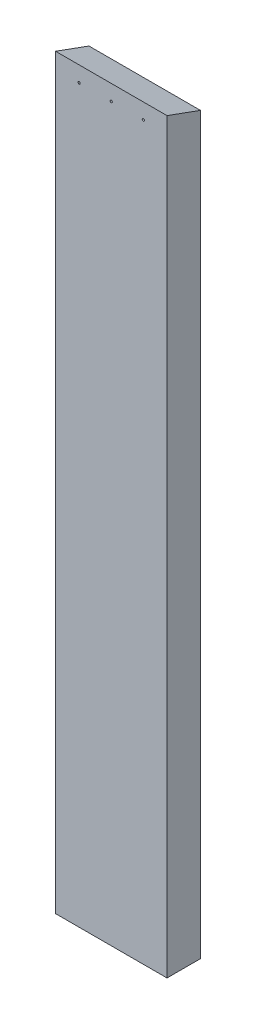
ISO-10303-21;
HEADER;
FILE_DESCRIPTION(('STEP AP214'),'2;1');
FILE_NAME('part.step','',(''),(''),'','','');
FILE_SCHEMA(('AUTOMOTIVE_DESIGN { 1 0 10303 214 1 1 1 1 }'));
ENDSEC;
DATA;
#1=APPLICATION_CONTEXT('core data for automotive mechanical design processes');
#2=APPLICATION_PROTOCOL_DEFINITION('international standard','automotive_design',2000,#1);
#3=PRODUCT_CONTEXT('',#1,'mechanical');
#4=PRODUCT('Part','Part','',(#3));
#5=PRODUCT_RELATED_PRODUCT_CATEGORY('part','',(#4));
#6=PRODUCT_DEFINITION_FORMATION('','',#4);
#7=PRODUCT_DEFINITION_CONTEXT('part definition',#1,'design');
#8=PRODUCT_DEFINITION('design','',#6,#7);
#9=PRODUCT_DEFINITION_SHAPE('','',#8);
#10=(LENGTH_UNIT() NAMED_UNIT(*) SI_UNIT(.MILLI.,.METRE.));
#11=(NAMED_UNIT(*) PLANE_ANGLE_UNIT() SI_UNIT($,.RADIAN.));
#12=(NAMED_UNIT(*) SI_UNIT($,.STERADIAN.) SOLID_ANGLE_UNIT());
#13=UNCERTAINTY_MEASURE_WITH_UNIT(LENGTH_MEASURE(1.E-05),#10,'distance_accuracy_value','');
#14=(GEOMETRIC_REPRESENTATION_CONTEXT(3) GLOBAL_UNCERTAINTY_ASSIGNED_CONTEXT((#13)) GLOBAL_UNIT_ASSIGNED_CONTEXT((#10,
#11,#12)) REPRESENTATION_CONTEXT('',''));
#15=CARTESIAN_POINT('',(0.,0.,0.));
#16=DIRECTION('',(0.,0.,1.));
#17=DIRECTION('',(1.,0.,0.));
#18=AXIS2_PLACEMENT_3D('',#15,#16,#17);
#19=CARTESIAN_POINT('',(0.,425.45,0.));
#20=DIRECTION('',(1.,0.,0.));
#21=DIRECTION('',(0.,0.,-1.));
#22=AXIS2_PLACEMENT_3D('',#19,#20,#21);
#23=PLANE('',#22);
#24=DIRECTION('',(0.,-1.,0.));
#25=VECTOR('',#24,1.);
#26=CARTESIAN_POINT('',(0.,425.45,0.));
#27=LINE('',#26,#25);
#28=CARTESIAN_POINT('',(0.,425.45,0.));
#29=VERTEX_POINT('',#28);
#30=CARTESIAN_POINT('',(0.,0.,0.));
#31=VERTEX_POINT('',#30);
#32=EDGE_CURVE('E11',#29,#31,#27,.T.);
#33=ORIENTED_EDGE('',*,*,#32,.F.);
#34=DIRECTION('',(0.,0.342020143325664,0.93969262078591));
#35=VECTOR('',#34,1.);
#36=CARTESIAN_POINT('',(0.,425.45,0.));
#37=LINE('',#36,#35);
#38=CARTESIAN_POINT('',(0.,418.516367037229,-19.05));
#39=VERTEX_POINT('',#38);
#40=EDGE_CURVE('E58',#39,#29,#37,.T.);
#41=ORIENTED_EDGE('',*,*,#40,.F.);
#42=DIRECTION('',(0.,-1.,0.));
#43=VECTOR('',#42,1.);
#44=CARTESIAN_POINT('',(0.,425.45,-19.05));
#45=LINE('',#44,#43);
#46=CARTESIAN_POINT('',(0.,0.,-19.05));
#47=VERTEX_POINT('',#46);
#48=EDGE_CURVE('E88',#39,#47,#45,.T.);
#49=ORIENTED_EDGE('',*,*,#48,.T.);
#50=DIRECTION('',(0.,0.,1.));
#51=VECTOR('',#50,1.);
#52=CARTESIAN_POINT('',(0.,0.,0.));
#53=LINE('',#52,#51);
#54=EDGE_CURVE('E100',#47,#31,#53,.T.);
#55=ORIENTED_EDGE('',*,*,#54,.T.);
#56=EDGE_LOOP('',(#33,#41,#49,#55));
#57=FACE_BOUND('',#56,.T.);
#58=ADVANCED_FACE('F41',(#57),#23,.F.);
#59=CARTESIAN_POINT('',(0.,425.45,0.));
#60=DIRECTION('',(0.,0.,-1.));
#61=DIRECTION('',(-1.,0.,0.));
#62=AXIS2_PLACEMENT_3D('',#59,#60,#61);
#63=PLANE('',#62);
#64=CARTESIAN_POINT('',(13.4366000714349,416.56,0.));
#65=DIRECTION('',(0.,0.,1.));
#66=DIRECTION('',(-1.,0.,0.));
#67=AXIS2_PLACEMENT_3D('',#64,#65,#66);
#68=CIRCLE('',#67,0.634999999999992);
#69=CARTESIAN_POINT('',(12.8016000714349,416.56,0.));
#70=VERTEX_POINT('',#69);
#71=EDGE_CURVE('E140',#70,#70,#68,.T.);
#72=ORIENTED_EDGE('',*,*,#71,.F.);
#73=EDGE_LOOP('',(#72));
#74=FACE_BOUND('',#73,.T.);
#75=CARTESIAN_POINT('',(50.0126000714349,416.56,0.));
#76=DIRECTION('',(0.,0.,1.));
#77=DIRECTION('',(1.,0.,0.));
#78=AXIS2_PLACEMENT_3D('',#75,#76,#77);
#79=CIRCLE('',#78,0.634999999999985);
#80=CARTESIAN_POINT('',(50.6476000714348,416.56,0.));
#81=VERTEX_POINT('',#80);
#82=EDGE_CURVE('E134',#81,#81,#79,.T.);
#83=ORIENTED_EDGE('',*,*,#82,.F.);
#84=EDGE_LOOP('',(#83));
#85=FACE_BOUND('',#84,.T.);
#86=CARTESIAN_POINT('',(31.7246000714349,416.56,0.));
#87=DIRECTION('',(0.,0.,1.));
#88=DIRECTION('',(1.,0.,0.));
#89=AXIS2_PLACEMENT_3D('',#86,#87,#88);
#90=CIRCLE('',#89,0.634999999999985);
#91=CARTESIAN_POINT('',(32.3596000714348,416.56,0.));
#92=VERTEX_POINT('',#91);
#93=EDGE_CURVE('E131',#92,#92,#90,.T.);
#94=ORIENTED_EDGE('',*,*,#93,.F.);
#95=EDGE_LOOP('',(#94));
#96=FACE_BOUND('',#95,.T.);
#97=DIRECTION('',(1.,0.,0.));
#98=VECTOR('',#97,1.);
#99=CARTESIAN_POINT('',(0.,0.,0.));
#100=LINE('',#99,#98);
#101=CARTESIAN_POINT('',(63.5,0.,0.));
#102=VERTEX_POINT('',#101);
#103=EDGE_CURVE('E96',#31,#102,#100,.T.);
#104=ORIENTED_EDGE('',*,*,#103,.T.);
#105=DIRECTION('',(0.,-1.,0.));
#106=VECTOR('',#105,1.);
#107=CARTESIAN_POINT('',(63.5,425.45,0.));
#108=LINE('',#107,#106);
#109=CARTESIAN_POINT('',(63.5,425.45,0.));
#110=VERTEX_POINT('',#109);
#111=EDGE_CURVE('E50',#110,#102,#108,.T.);
#112=ORIENTED_EDGE('',*,*,#111,.F.);
#113=DIRECTION('',(1.,0.,0.));
#114=VECTOR('',#113,1.);
#115=CARTESIAN_POINT('',(0.,425.45,0.));
#116=LINE('',#115,#114);
#117=EDGE_CURVE('E101',#29,#110,#116,.T.);
#118=ORIENTED_EDGE('',*,*,#117,.F.);
#119=ORIENTED_EDGE('',*,*,#32,.T.);
#120=EDGE_LOOP('',(#104,#112,#118,#119));
#121=FACE_BOUND('',#120,.T.);
#122=ADVANCED_FACE('F153',(#74,#85,#96,#121),#63,.F.);
#123=CARTESIAN_POINT('',(63.5,425.45,0.));
#124=DIRECTION('',(-1.,0.,0.));
#125=DIRECTION('',(0.,0.,1.));
#126=AXIS2_PLACEMENT_3D('',#123,#124,#125);
#127=PLANE('',#126);
#128=DIRECTION('',(0.,-1.,0.));
#129=VECTOR('',#128,1.);
#130=CARTESIAN_POINT('',(63.5,425.45,-19.05));
#131=LINE('',#130,#129);
#132=CARTESIAN_POINT('',(63.5,418.516367037229,-19.05));
#133=VERTEX_POINT('',#132);
#134=CARTESIAN_POINT('',(63.5,0.,-19.05));
#135=VERTEX_POINT('',#134);
#136=EDGE_CURVE('E77',#133,#135,#131,.T.);
#137=ORIENTED_EDGE('',*,*,#136,.F.);
#138=DIRECTION('',(0.,0.342020143325664,0.93969262078591));
#139=VECTOR('',#138,1.);
#140=CARTESIAN_POINT('',(63.5,425.45,0.));
#141=LINE('',#140,#139);
#142=EDGE_CURVE('E149',#133,#110,#141,.T.);
#143=ORIENTED_EDGE('',*,*,#142,.T.);
#144=ORIENTED_EDGE('',*,*,#111,.T.);
#145=DIRECTION('',(0.,0.,-1.));
#146=VECTOR('',#145,1.);
#147=CARTESIAN_POINT('',(63.5,0.,0.));
#148=LINE('',#147,#146);
#149=EDGE_CURVE('E92',#102,#135,#148,.T.);
#150=ORIENTED_EDGE('',*,*,#149,.T.);
#151=EDGE_LOOP('',(#137,#143,#144,#150));
#152=FACE_BOUND('',#151,.T.);
#153=ADVANCED_FACE('F93',(#152),#127,.F.);
#154=CARTESIAN_POINT('',(0.,425.45,-19.05));
#155=DIRECTION('',(0.,0.,1.));
#156=DIRECTION('',(1.,0.,0.));
#157=AXIS2_PLACEMENT_3D('',#154,#155,#156);
#158=PLANE('',#157);
#159=CARTESIAN_POINT('',(13.4366000714349,416.56,-19.05));
#160=DIRECTION('',(0.,0.,1.));
#161=DIRECTION('',(-1.,0.,0.));
#162=AXIS2_PLACEMENT_3D('',#159,#160,#161);
#163=CIRCLE('',#162,0.634999999999992);
#164=CARTESIAN_POINT('',(12.8016000714349,416.56,-19.05));
#165=VERTEX_POINT('',#164);
#166=EDGE_CURVE('E137',#165,#165,#163,.T.);
#167=ORIENTED_EDGE('',*,*,#166,.T.);
#168=EDGE_LOOP('',(#167));
#169=FACE_BOUND('',#168,.T.);
#170=CARTESIAN_POINT('',(50.0126000714349,416.56,-19.05));
#171=DIRECTION('',(0.,0.,1.));
#172=DIRECTION('',(1.,0.,0.));
#173=AXIS2_PLACEMENT_3D('',#170,#171,#172);
#174=CIRCLE('',#173,0.634999999999985);
#175=CARTESIAN_POINT('',(50.6476000714348,416.56,-19.05));
#176=VERTEX_POINT('',#175);
#177=EDGE_CURVE('E143',#176,#176,#174,.T.);
#178=ORIENTED_EDGE('',*,*,#177,.T.);
#179=EDGE_LOOP('',(#178));
#180=FACE_BOUND('',#179,.T.);
#181=CARTESIAN_POINT('',(31.7246000714349,416.56,-19.05));
#182=DIRECTION('',(0.,0.,1.));
#183=DIRECTION('',(1.,0.,0.));
#184=AXIS2_PLACEMENT_3D('',#181,#182,#183);
#185=CIRCLE('',#184,0.634999999999985);
#186=CARTESIAN_POINT('',(32.3596000714348,416.56,-19.05));
#187=VERTEX_POINT('',#186);
#188=EDGE_CURVE('E126',#187,#187,#185,.T.);
#189=ORIENTED_EDGE('',*,*,#188,.T.);
#190=EDGE_LOOP('',(#189));
#191=FACE_BOUND('',#190,.T.);
#192=ORIENTED_EDGE('',*,*,#48,.F.);
#193=DIRECTION('',(-1.,0.,0.));
#194=VECTOR('',#193,1.);
#195=CARTESIAN_POINT('',(63.5,418.516367037229,-19.05));
#196=LINE('',#195,#194);
#197=EDGE_CURVE('E85',#133,#39,#196,.T.);
#198=ORIENTED_EDGE('',*,*,#197,.F.);
#199=ORIENTED_EDGE('',*,*,#136,.T.);
#200=DIRECTION('',(-1.,0.,0.));
#201=VECTOR('',#200,1.);
#202=CARTESIAN_POINT('',(0.,0.,-19.05));
#203=LINE('',#202,#201);
#204=EDGE_CURVE('E82',#135,#47,#203,.T.);
#205=ORIENTED_EDGE('',*,*,#204,.T.);
#206=EDGE_LOOP('',(#192,#198,#199,#205));
#207=FACE_BOUND('',#206,.T.);
#208=ADVANCED_FACE('F80',(#169,#180,#191,#207),#158,.F.);
#209=CARTESIAN_POINT('',(0.,0.,0.));
#210=DIRECTION('',(0.,-1.,0.));
#211=DIRECTION('',(0.,0.,-1.));
#212=AXIS2_PLACEMENT_3D('',#209,#210,#211);
#213=PLANE('',#212);
#214=CARTESIAN_POINT('',(13.4874000714349,0.,-9.52499969421802));
#215=DIRECTION('',(0.,-1.,0.));
#216=DIRECTION('',(0.,0.,-1.));
#217=AXIS2_PLACEMENT_3D('',#214,#215,#216);
#218=CIRCLE('',#217,0.634999999999999);
#219=CARTESIAN_POINT('',(13.4874000714349,0.,-10.159999694218));
#220=VERTEX_POINT('',#219);
#221=EDGE_CURVE('E44',#220,#220,#218,.F.);
#222=ORIENTED_EDGE('',*,*,#221,.T.);
#223=EDGE_LOOP('',(#222));
#224=FACE_BOUND('',#223,.T.);
#225=CARTESIAN_POINT('',(31.7500000714349,0.,-9.52499969421802));
#226=DIRECTION('',(0.,-1.,0.));
#227=DIRECTION('',(0.,0.,-1.));
#228=AXIS2_PLACEMENT_3D('',#225,#226,#227);
#229=CIRCLE('',#228,0.634999999999995);
#230=CARTESIAN_POINT('',(31.7500000714349,0.,-10.159999694218));
#231=VERTEX_POINT('',#230);
#232=EDGE_CURVE('E110',#231,#231,#229,.F.);
#233=ORIENTED_EDGE('',*,*,#232,.T.);
#234=EDGE_LOOP('',(#233));
#235=FACE_BOUND('',#234,.T.);
#236=CARTESIAN_POINT('',(50.0126000714349,0.,-9.52499969421799));
#237=DIRECTION('',(0.,-1.,0.));
#238=DIRECTION('',(0.,0.,-1.));
#239=AXIS2_PLACEMENT_3D('',#236,#237,#238);
#240=CIRCLE('',#239,0.634999999999995);
#241=CARTESIAN_POINT('',(50.0126000714349,0.,-10.159999694218));
#242=VERTEX_POINT('',#241);
#243=EDGE_CURVE('E108',#242,#242,#240,.F.);
#244=ORIENTED_EDGE('',*,*,#243,.T.);
#245=EDGE_LOOP('',(#244));
#246=FACE_BOUND('',#245,.T.);
#247=ORIENTED_EDGE('',*,*,#54,.F.);
#248=ORIENTED_EDGE('',*,*,#204,.F.);
#249=ORIENTED_EDGE('',*,*,#149,.F.);
#250=ORIENTED_EDGE('',*,*,#103,.F.);
#251=EDGE_LOOP('',(#247,#248,#249,#250));
#252=FACE_BOUND('',#251,.T.);
#253=ADVANCED_FACE('F98',(#224,#235,#246,#252),#213,.T.);
#254=CARTESIAN_POINT('',(50.0126000714349,-1.2E-05,-9.52499969421799));
#255=DIRECTION('',(0.,1.,0.));
#256=DIRECTION('',(0.,0.,1.));
#257=AXIS2_PLACEMENT_3D('',#254,#255,#256);
#258=CYLINDRICAL_SURFACE('',#257,0.634999999999995);
#259=ORIENTED_EDGE('',*,*,#243,.F.);
#260=EDGE_LOOP('',(#259));
#261=FACE_BOUND('',#260,.T.);
#262=CARTESIAN_POINT('',(50.0126000714349,50.8,-9.52499969421799));
#263=DIRECTION('',(0.,-1.,0.));
#264=DIRECTION('',(0.,0.,-1.));
#265=AXIS2_PLACEMENT_3D('',#262,#263,#264);
#266=CIRCLE('',#265,0.634999999999995);
#267=CARTESIAN_POINT('',(50.0126000714349,50.8,-10.159999694218));
#268=VERTEX_POINT('',#267);
#269=EDGE_CURVE('E122',#268,#268,#266,.T.);
#270=ORIENTED_EDGE('',*,*,#269,.F.);
#271=EDGE_LOOP('',(#270));
#272=FACE_BOUND('',#271,.T.);
#273=ADVANCED_FACE('F183',(#261,#272),#258,.F.);
#274=CARTESIAN_POINT('',(50.0126000714349,50.8,-9.52499969421799));
#275=DIRECTION('',(0.,-1.,0.));
#276=DIRECTION('',(0.,0.,-1.));
#277=AXIS2_PLACEMENT_3D('',#274,#275,#276);
#278=PLANE('',#277);
#279=ORIENTED_EDGE('',*,*,#269,.T.);
#280=EDGE_LOOP('',(#279));
#281=FACE_BOUND('',#280,.T.);
#282=ADVANCED_FACE('F184',(#281),#278,.T.);
#283=CARTESIAN_POINT('',(31.7500000714349,-1.2E-05,-9.52499969421802));
#284=DIRECTION('',(0.,1.,0.));
#285=DIRECTION('',(0.,0.,1.));
#286=AXIS2_PLACEMENT_3D('',#283,#284,#285);
#287=CYLINDRICAL_SURFACE('',#286,0.634999999999995);
#288=ORIENTED_EDGE('',*,*,#232,.F.);
#289=EDGE_LOOP('',(#288));
#290=FACE_BOUND('',#289,.T.);
#291=CARTESIAN_POINT('',(31.7500000714349,50.8,-9.52499969421802));
#292=DIRECTION('',(0.,-1.,0.));
#293=DIRECTION('',(0.,0.,-1.));
#294=AXIS2_PLACEMENT_3D('',#291,#292,#293);
#295=CIRCLE('',#294,0.634999999999995);
#296=CARTESIAN_POINT('',(31.7500000714349,50.8,-10.159999694218));
#297=VERTEX_POINT('',#296);
#298=EDGE_CURVE('E125',#297,#297,#295,.T.);
#299=ORIENTED_EDGE('',*,*,#298,.F.);
#300=EDGE_LOOP('',(#299));
#301=FACE_BOUND('',#300,.T.);
#302=ADVANCED_FACE('F187',(#290,#301),#287,.F.);
#303=CARTESIAN_POINT('',(31.7500000714349,50.8,-9.52499969421802));
#304=DIRECTION('',(0.,-1.,0.));
#305=DIRECTION('',(0.,0.,-1.));
#306=AXIS2_PLACEMENT_3D('',#303,#304,#305);
#307=PLANE('',#306);
#308=ORIENTED_EDGE('',*,*,#298,.T.);
#309=EDGE_LOOP('',(#308));
#310=FACE_BOUND('',#309,.T.);
#311=ADVANCED_FACE('F192',(#310),#307,.T.);
#312=CARTESIAN_POINT('',(13.4874000714349,-1.2E-05,-9.52499969421802));
#313=DIRECTION('',(0.,1.,0.));
#314=DIRECTION('',(0.,0.,1.));
#315=AXIS2_PLACEMENT_3D('',#312,#313,#314);
#316=CYLINDRICAL_SURFACE('',#315,0.634999999999999);
#317=ORIENTED_EDGE('',*,*,#221,.F.);
#318=EDGE_LOOP('',(#317));
#319=FACE_BOUND('',#318,.T.);
#320=CARTESIAN_POINT('',(13.4874000714349,50.8,-9.52499969421802));
#321=DIRECTION('',(0.,-1.,0.));
#322=DIRECTION('',(0.,0.,-1.));
#323=AXIS2_PLACEMENT_3D('',#320,#321,#322);
#324=CIRCLE('',#323,0.634999999999999);
#325=CARTESIAN_POINT('',(13.4874000714349,50.8,-10.159999694218));
#326=VERTEX_POINT('',#325);
#327=EDGE_CURVE('E111',#326,#326,#324,.T.);
#328=ORIENTED_EDGE('',*,*,#327,.F.);
#329=EDGE_LOOP('',(#328));
#330=FACE_BOUND('',#329,.T.);
#331=ADVANCED_FACE('F195',(#319,#330),#316,.F.);
#332=CARTESIAN_POINT('',(13.4874000714349,50.8,-9.52499969421802));
#333=DIRECTION('',(0.,-1.,0.));
#334=DIRECTION('',(0.,0.,-1.));
#335=AXIS2_PLACEMENT_3D('',#332,#333,#334);
#336=PLANE('',#335);
#337=ORIENTED_EDGE('',*,*,#327,.T.);
#338=EDGE_LOOP('',(#337));
#339=FACE_BOUND('',#338,.T.);
#340=ADVANCED_FACE('F202',(#339),#336,.T.);
#341=CARTESIAN_POINT('',(31.7246000714349,416.56,-19.05));
#342=DIRECTION('',(0.,0.,1.));
#343=DIRECTION('',(1.,0.,0.));
#344=AXIS2_PLACEMENT_3D('',#341,#342,#343);
#345=CYLINDRICAL_SURFACE('',#344,0.634999999999985);
#346=ORIENTED_EDGE('',*,*,#188,.F.);
#347=EDGE_LOOP('',(#346));
#348=FACE_BOUND('',#347,.T.);
#349=ORIENTED_EDGE('',*,*,#93,.T.);
#350=EDGE_LOOP('',(#349));
#351=FACE_BOUND('',#350,.T.);
#352=ADVANCED_FACE('F206',(#348,#351),#345,.F.);
#353=CARTESIAN_POINT('',(50.0126000714349,416.56,-19.05));
#354=DIRECTION('',(0.,0.,1.));
#355=DIRECTION('',(1.,0.,0.));
#356=AXIS2_PLACEMENT_3D('',#353,#354,#355);
#357=CYLINDRICAL_SURFACE('',#356,0.634999999999985);
#358=ORIENTED_EDGE('',*,*,#177,.F.);
#359=EDGE_LOOP('',(#358));
#360=FACE_BOUND('',#359,.T.);
#361=ORIENTED_EDGE('',*,*,#82,.T.);
#362=EDGE_LOOP('',(#361));
#363=FACE_BOUND('',#362,.T.);
#364=ADVANCED_FACE('F163',(#360,#363),#357,.F.);
#365=CARTESIAN_POINT('',(13.4366000714349,416.56,-19.05));
#366=DIRECTION('',(0.,0.,1.));
#367=DIRECTION('',(1.,0.,0.));
#368=AXIS2_PLACEMENT_3D('',#365,#366,#367);
#369=CYLINDRICAL_SURFACE('',#368,0.634999999999992);
#370=ORIENTED_EDGE('',*,*,#166,.F.);
#371=EDGE_LOOP('',(#370));
#372=FACE_BOUND('',#371,.T.);
#373=ORIENTED_EDGE('',*,*,#71,.T.);
#374=EDGE_LOOP('',(#373));
#375=FACE_BOUND('',#374,.T.);
#376=ADVANCED_FACE('F157',(#372,#375),#369,.F.);
#377=CARTESIAN_POINT('',(63.5,425.45,0.));
#378=DIRECTION('',(0.,-0.93969262078591,0.342020143325664));
#379=DIRECTION('',(0.,-0.342020143325664,-0.93969262078591));
#380=AXIS2_PLACEMENT_3D('',#377,#378,#379);
#381=PLANE('',#380);
#382=ORIENTED_EDGE('',*,*,#40,.T.);
#383=ORIENTED_EDGE('',*,*,#117,.T.);
#384=ORIENTED_EDGE('',*,*,#142,.F.);
#385=ORIENTED_EDGE('',*,*,#197,.T.);
#386=EDGE_LOOP('',(#382,#383,#384,#385));
#387=FACE_BOUND('',#386,.T.);
#388=ADVANCED_FACE('F155',(#387),#381,.F.);
#389=CLOSED_SHELL('',(#58,#122,#153,#208,#253,#273,#282,#302,#311,#331,#340,#352,#364,#376,#388));
#390=MANIFOLD_SOLID_BREP('B2',#389);
#391=ADVANCED_BREP_SHAPE_REPRESENTATION('',(#18,#390),#14);
#392=SHAPE_DEFINITION_REPRESENTATION(#9,#391);
ENDSEC;
END-ISO-10303-21;
